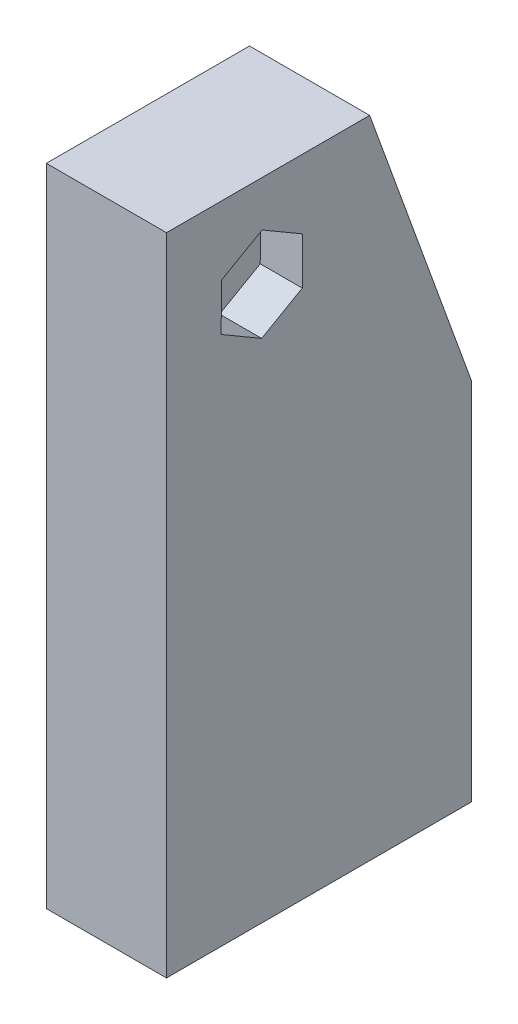
ISO-10303-21;
HEADER;
FILE_DESCRIPTION(('STEP AP214'),'2;1');
FILE_NAME('part.step','',(''),(''),'','','');
FILE_SCHEMA(('AUTOMOTIVE_DESIGN { 1 0 10303 214 1 1 1 1 }'));
ENDSEC;
DATA;
#1=APPLICATION_CONTEXT('core data for automotive mechanical design processes');
#2=APPLICATION_PROTOCOL_DEFINITION('international standard','automotive_design',2000,#1);
#3=PRODUCT_CONTEXT('',#1,'mechanical');
#4=PRODUCT('Part','Part','',(#3));
#5=PRODUCT_RELATED_PRODUCT_CATEGORY('part','',(#4));
#6=PRODUCT_DEFINITION_FORMATION('','',#4);
#7=PRODUCT_DEFINITION_CONTEXT('part definition',#1,'design');
#8=PRODUCT_DEFINITION('design','',#6,#7);
#9=PRODUCT_DEFINITION_SHAPE('','',#8);
#10=(LENGTH_UNIT() NAMED_UNIT(*) SI_UNIT(.MILLI.,.METRE.));
#11=(NAMED_UNIT(*) PLANE_ANGLE_UNIT() SI_UNIT($,.RADIAN.));
#12=(NAMED_UNIT(*) SI_UNIT($,.STERADIAN.) SOLID_ANGLE_UNIT());
#13=UNCERTAINTY_MEASURE_WITH_UNIT(LENGTH_MEASURE(1.E-05),#10,'distance_accuracy_value','');
#14=(GEOMETRIC_REPRESENTATION_CONTEXT(3) GLOBAL_UNCERTAINTY_ASSIGNED_CONTEXT((#13)) GLOBAL_UNIT_ASSIGNED_CONTEXT((#10,
#11,#12)) REPRESENTATION_CONTEXT('',''));
#15=CARTESIAN_POINT('',(0.,0.,0.));
#16=DIRECTION('',(0.,0.,1.));
#17=DIRECTION('',(1.,0.,0.));
#18=AXIS2_PLACEMENT_3D('',#15,#16,#17);
#19=CARTESIAN_POINT('',(84.7484293410802,-27.1169724546259,-50.8));
#20=DIRECTION('',(0.,1.,0.));
#21=DIRECTION('',(0.,0.,1.));
#22=AXIS2_PLACEMENT_3D('',#19,#20,#21);
#23=PLANE('',#22);
#24=DIRECTION('',(-1.,0.,0.));
#25=VECTOR('',#24,1.);
#26=CARTESIAN_POINT('',(104.74942934108,-27.1169724546259,-33.8187440117902));
#27=LINE('',#26,#25);
#28=CARTESIAN_POINT('',(104.74842934108,-27.1169724546259,-33.8187440117902));
#29=VERTEX_POINT('',#28);
#30=CARTESIAN_POINT('',(84.7484293410802,-27.1169724546259,-33.8187440117902));
#31=VERTEX_POINT('',#30);
#32=EDGE_CURVE('E160',#29,#31,#27,.T.);
#33=ORIENTED_EDGE('',*,*,#32,.T.);
#34=DIRECTION('',(0.,0.,1.));
#35=VECTOR('',#34,1.);
#36=CARTESIAN_POINT('',(84.7484293410802,-27.1169724546259,-50.8));
#37=LINE('',#36,#35);
#38=CARTESIAN_POINT('',(84.7484293410802,-27.1169724546259,0.));
#39=VERTEX_POINT('',#38);
#40=EDGE_CURVE('E45',#31,#39,#37,.T.);
#41=ORIENTED_EDGE('',*,*,#40,.T.);
#42=DIRECTION('',(-1.,0.,0.));
#43=VECTOR('',#42,1.);
#44=CARTESIAN_POINT('',(84.7484293410802,-27.1169724546259,0.));
#45=LINE('',#44,#43);
#46=CARTESIAN_POINT('',(104.74842934108,-27.1169724546259,0.));
#47=VERTEX_POINT('',#46);
#48=EDGE_CURVE('E181',#47,#39,#45,.T.);
#49=ORIENTED_EDGE('',*,*,#48,.F.);
#50=DIRECTION('',(0.,0.,1.));
#51=VECTOR('',#50,1.);
#52=CARTESIAN_POINT('',(104.74842934108,-27.1169724546259,-50.8));
#53=LINE('',#52,#51);
#54=EDGE_CURVE('E11',#29,#47,#53,.T.);
#55=ORIENTED_EDGE('',*,*,#54,.F.);
#56=EDGE_LOOP('',(#33,#41,#49,#55));
#57=FACE_BOUND('',#56,.T.);
#58=ADVANCED_FACE('F42',(#57),#23,.T.);
#59=CARTESIAN_POINT('',(104.74842934108,-27.1169724546259,-50.8));
#60=DIRECTION('',(1.,0.,0.));
#61=DIRECTION('',(0.,1.,0.));
#62=AXIS2_PLACEMENT_3D('',#59,#60,#61);
#63=PLANE('',#62);
#64=DIRECTION('',(0.,0.940081369298026,0.340950170990935));
#65=VECTOR('',#64,1.);
#66=CARTESIAN_POINT('',(104.74842934108,-27.1169724546259,-33.8187440117902));
#67=LINE('',#66,#65);
#68=CARTESIAN_POINT('',(104.74842934108,-73.938366722884,-50.8));
#69=VERTEX_POINT('',#68);
#70=EDGE_CURVE('E59',#69,#29,#67,.T.);
#71=ORIENTED_EDGE('',*,*,#70,.T.);
#72=ORIENTED_EDGE('',*,*,#54,.T.);
#73=DIRECTION('',(0.,1.,0.));
#74=VECTOR('',#73,1.);
#75=CARTESIAN_POINT('',(104.74842934108,-27.1169724546259,0.));
#76=LINE('',#75,#74);
#77=CARTESIAN_POINT('',(104.74842934108,-134.553679698753,0.));
#78=VERTEX_POINT('',#77);
#79=EDGE_CURVE('E191',#78,#47,#76,.T.);
#80=ORIENTED_EDGE('',*,*,#79,.F.);
#81=DIRECTION('',(0.,0.,1.));
#82=VECTOR('',#81,1.);
#83=CARTESIAN_POINT('',(104.74842934108,-134.553679698753,-50.8));
#84=LINE('',#83,#82);
#85=CARTESIAN_POINT('',(104.74842934108,-134.553679698753,-50.8));
#86=VERTEX_POINT('',#85);
#87=EDGE_CURVE('E51',#86,#78,#84,.T.);
#88=ORIENTED_EDGE('',*,*,#87,.F.);
#89=DIRECTION('',(0.,1.,0.));
#90=VECTOR('',#89,1.);
#91=CARTESIAN_POINT('',(104.74842934108,-27.1169724546259,-50.8));
#92=LINE('',#91,#90);
#93=EDGE_CURVE('E177',#86,#69,#92,.T.);
#94=ORIENTED_EDGE('',*,*,#93,.T.);
#95=EDGE_LOOP('',(#71,#72,#80,#88,#94));
#96=FACE_BOUND('',#95,.T.);
#97=DIRECTION('',(0.,0.495616398342477,-0.868541527904124));
#98=VECTOR('',#97,1.);
#99=CARTESIAN_POINT('',(104.74842934108,-46.4098612503703,-22.6052163121419));
#100=LINE('',#99,#98);
#101=CARTESIAN_POINT('',(104.74842934108,-50.2728087738409,-15.8356050654815));
#102=VERTEX_POINT('',#101);
#103=CARTESIAN_POINT('',(104.74842934108,-46.4098612503703,-22.605216312142));
#104=VERTEX_POINT('',#103);
#105=EDGE_CURVE('E67',#102,#104,#100,.T.);
#106=ORIENTED_EDGE('',*,*,#105,.F.);
#107=DIRECTION('',(0.,-0.504370828235485,-0.863487155448795));
#108=VECTOR('',#107,1.);
#109=CARTESIAN_POINT('',(104.74842934108,-50.2728087738409,-15.8356050654815));
#110=LINE('',#109,#108);
#111=CARTESIAN_POINT('',(104.74842934108,-46.3416272222233,-9.10538875333951));
#112=VERTEX_POINT('',#111);
#113=EDGE_CURVE('E460',#112,#102,#110,.T.);
#114=ORIENTED_EDGE('',*,*,#113,.F.);
#115=DIRECTION('',(0.,-0.999987226577961,0.00505437245533002));
#116=VECTOR('',#115,1.);
#117=CARTESIAN_POINT('',(104.74842934108,-46.3416272222233,-9.10538875333951));
#118=LINE('',#117,#116);
#119=CARTESIAN_POINT('',(104.74842934108,-38.5474981471352,-9.14478368785804));
#120=VERTEX_POINT('',#119);
#121=EDGE_CURVE('E466',#120,#112,#118,.T.);
#122=ORIENTED_EDGE('',*,*,#121,.F.);
#123=DIRECTION('',(0.,-0.495616398342476,0.868541527904125));
#124=VECTOR('',#123,1.);
#125=CARTESIAN_POINT('',(104.74842934108,-38.5474981471352,-9.14478368785804));
#126=LINE('',#125,#124);
#127=CARTESIAN_POINT('',(104.74842934108,-34.6845506236646,-15.9143949345185));
#128=VERTEX_POINT('',#127);
#129=EDGE_CURVE('E490',#128,#120,#126,.T.);
#130=ORIENTED_EDGE('',*,*,#129,.F.);
#131=DIRECTION('',(0.,0.504370828235485,0.863487155448795));
#132=VECTOR('',#131,1.);
#133=CARTESIAN_POINT('',(104.74842934108,-34.6845506236646,-15.9143949345185));
#134=LINE('',#133,#132);
#135=CARTESIAN_POINT('',(104.74842934108,-38.6157321752822,-22.6446112466605));
#136=VERTEX_POINT('',#135);
#137=EDGE_CURVE('E486',#136,#128,#134,.T.);
#138=ORIENTED_EDGE('',*,*,#137,.F.);
#139=DIRECTION('',(0.,0.999987226577961,-0.00505437245533001));
#140=VECTOR('',#139,1.);
#141=CARTESIAN_POINT('',(104.74842934108,-38.6157321752822,-22.6446112466605));
#142=LINE('',#141,#140);
#143=EDGE_CURVE('E482',#104,#136,#142,.T.);
#144=ORIENTED_EDGE('',*,*,#143,.F.);
#145=EDGE_LOOP('',(#106,#114,#122,#130,#138,#144));
#146=FACE_BOUND('',#145,.T.);
#147=ADVANCED_FACE('F172',(#96,#146),#63,.T.);
#148=CARTESIAN_POINT('',(104.74842934108,-134.553679698753,-50.8));
#149=DIRECTION('',(0.,-1.,0.));
#150=DIRECTION('',(0.,0.,-1.));
#151=AXIS2_PLACEMENT_3D('',#148,#149,#150);
#152=PLANE('',#151);
#153=DIRECTION('',(1.,0.,0.));
#154=VECTOR('',#153,1.);
#155=CARTESIAN_POINT('',(104.74842934108,-134.553679698753,0.));
#156=LINE('',#155,#154);
#157=CARTESIAN_POINT('',(84.7484293410802,-134.553679698753,0.));
#158=VERTEX_POINT('',#157);
#159=EDGE_CURVE('E194',#158,#78,#156,.T.);
#160=ORIENTED_EDGE('',*,*,#159,.F.);
#161=DIRECTION('',(0.,0.,1.));
#162=VECTOR('',#161,1.);
#163=CARTESIAN_POINT('',(84.7484293410802,-134.553679698753,-50.8));
#164=LINE('',#163,#162);
#165=CARTESIAN_POINT('',(84.7484293410802,-134.553679698753,-50.8));
#166=VERTEX_POINT('',#165);
#167=EDGE_CURVE('E208',#166,#158,#164,.T.);
#168=ORIENTED_EDGE('',*,*,#167,.F.);
#169=DIRECTION('',(1.,0.,0.));
#170=VECTOR('',#169,1.);
#171=CARTESIAN_POINT('',(104.74842934108,-134.553679698753,-50.8));
#172=LINE('',#171,#170);
#173=EDGE_CURVE('E201',#166,#86,#172,.T.);
#174=ORIENTED_EDGE('',*,*,#173,.T.);
#175=ORIENTED_EDGE('',*,*,#87,.T.);
#176=EDGE_LOOP('',(#160,#168,#174,#175));
#177=FACE_BOUND('',#176,.T.);
#178=ADVANCED_FACE('F234',(#177),#152,.T.);
#179=CARTESIAN_POINT('',(84.7484293410802,-134.553679698753,-50.8));
#180=DIRECTION('',(-1.,0.,0.));
#181=DIRECTION('',(0.,0.,1.));
#182=AXIS2_PLACEMENT_3D('',#179,#180,#181);
#183=PLANE('',#182);
#184=DIRECTION('',(0.,0.940081369298026,0.340950170990935));
#185=VECTOR('',#184,1.);
#186=CARTESIAN_POINT('',(84.7484293410802,-27.1169724546259,-33.8187440117902));
#187=LINE('',#186,#185);
#188=CARTESIAN_POINT('',(84.7484293410802,-73.938366722884,-50.8));
#189=VERTEX_POINT('',#188);
#190=EDGE_CURVE('E163',#189,#31,#187,.T.);
#191=ORIENTED_EDGE('',*,*,#190,.F.);
#192=DIRECTION('',(0.,-1.,0.));
#193=VECTOR('',#192,1.);
#194=CARTESIAN_POINT('',(84.7484293410802,-134.553679698753,-50.8));
#195=LINE('',#194,#193);
#196=EDGE_CURVE('E196',#189,#166,#195,.T.);
#197=ORIENTED_EDGE('',*,*,#196,.T.);
#198=ORIENTED_EDGE('',*,*,#167,.T.);
#199=DIRECTION('',(0.,-1.,0.));
#200=VECTOR('',#199,1.);
#201=CARTESIAN_POINT('',(84.7484293410802,-134.553679698753,0.));
#202=LINE('',#201,#200);
#203=EDGE_CURVE('E187',#39,#158,#202,.T.);
#204=ORIENTED_EDGE('',*,*,#203,.F.);
#205=ORIENTED_EDGE('',*,*,#40,.F.);
#206=EDGE_LOOP('',(#191,#197,#198,#204,#205));
#207=FACE_BOUND('',#206,.T.);
#208=DIRECTION('',(0.,0.999987226577961,-0.00505437245533002));
#209=VECTOR('',#208,1.);
#210=CARTESIAN_POINT('',(84.7484293410802,-46.3416272222233,-9.10538875333951));
#211=LINE('',#210,#209);
#212=CARTESIAN_POINT('',(84.7484293410802,-46.3416272222233,-9.10538875333951));
#213=VERTEX_POINT('',#212);
#214=CARTESIAN_POINT('',(84.7484293410802,-38.5474981471352,-9.14478368785804));
#215=VERTEX_POINT('',#214);
#216=EDGE_CURVE('E500',#213,#215,#211,.T.);
#217=ORIENTED_EDGE('',*,*,#216,.F.);
#218=DIRECTION('',(0.,0.504370828235485,0.863487155448795));
#219=VECTOR('',#218,1.);
#220=CARTESIAN_POINT('',(84.7484293410802,-50.2728087738409,-15.8356050654815));
#221=LINE('',#220,#219);
#222=CARTESIAN_POINT('',(84.7484293410802,-50.2728087738409,-15.8356050654815));
#223=VERTEX_POINT('',#222);
#224=EDGE_CURVE('E520',#223,#213,#221,.T.);
#225=ORIENTED_EDGE('',*,*,#224,.F.);
#226=DIRECTION('',(0.,-0.495616398342477,0.868541527904124));
#227=VECTOR('',#226,1.);
#228=CARTESIAN_POINT('',(84.7484293410802,-46.4098612503703,-22.6052163121419));
#229=LINE('',#228,#227);
#230=CARTESIAN_POINT('',(84.7484293410802,-46.4098612503703,-22.6052163121419));
#231=VERTEX_POINT('',#230);
#232=EDGE_CURVE('E552',#231,#223,#229,.T.);
#233=ORIENTED_EDGE('',*,*,#232,.F.);
#234=DIRECTION('',(0.,-0.999987226577961,0.00505437245533001));
#235=VECTOR('',#234,1.);
#236=CARTESIAN_POINT('',(84.7484293410802,-38.6157321752822,-22.6446112466605));
#237=LINE('',#236,#235);
#238=CARTESIAN_POINT('',(84.7484293410802,-38.6157321752822,-22.6446112466605));
#239=VERTEX_POINT('',#238);
#240=EDGE_CURVE('E549',#239,#231,#237,.T.);
#241=ORIENTED_EDGE('',*,*,#240,.F.);
#242=DIRECTION('',(0.,-0.504370828235485,-0.863487155448795));
#243=VECTOR('',#242,1.);
#244=CARTESIAN_POINT('',(84.7484293410802,-34.6845506236646,-15.9143949345185));
#245=LINE('',#244,#243);
#246=CARTESIAN_POINT('',(84.7484293410802,-34.6845506236646,-15.9143949345185));
#247=VERTEX_POINT('',#246);
#248=EDGE_CURVE('E546',#247,#239,#245,.T.);
#249=ORIENTED_EDGE('',*,*,#248,.F.);
#250=DIRECTION('',(0.,0.495616398342476,-0.868541527904125));
#251=VECTOR('',#250,1.);
#252=CARTESIAN_POINT('',(84.7484293410802,-38.5474981471352,-9.14478368785804));
#253=LINE('',#252,#251);
#254=EDGE_CURVE('E542',#215,#247,#253,.T.);
#255=ORIENTED_EDGE('',*,*,#254,.F.);
#256=EDGE_LOOP('',(#217,#225,#233,#241,#249,#255));
#257=FACE_BOUND('',#256,.T.);
#258=ADVANCED_FACE('F225',(#207,#257),#183,.T.);
#259=CARTESIAN_POINT('',(0.,0.,-50.8));
#260=DIRECTION('',(0.,0.,-1.));
#261=DIRECTION('',(-1.,0.,0.));
#262=AXIS2_PLACEMENT_3D('',#259,#260,#261);
#263=PLANE('',#262);
#264=DIRECTION('',(1.,0.,0.));
#265=VECTOR('',#264,1.);
#266=CARTESIAN_POINT('',(104.74942934108,-73.938366722884,-50.8));
#267=LINE('',#266,#265);
#268=EDGE_CURVE('E168',#189,#69,#267,.T.);
#269=ORIENTED_EDGE('',*,*,#268,.T.);
#270=ORIENTED_EDGE('',*,*,#93,.F.);
#271=ORIENTED_EDGE('',*,*,#173,.F.);
#272=ORIENTED_EDGE('',*,*,#196,.F.);
#273=EDGE_LOOP('',(#269,#270,#271,#272));
#274=FACE_BOUND('',#273,.T.);
#275=ADVANCED_FACE('F232',(#274),#263,.T.);
#276=CARTESIAN_POINT('',(0.,0.,0.));
#277=DIRECTION('',(0.,0.,-1.));
#278=DIRECTION('',(-1.,0.,0.));
#279=AXIS2_PLACEMENT_3D('',#276,#277,#278);
#280=PLANE('',#279);
#281=ORIENTED_EDGE('',*,*,#48,.T.);
#282=ORIENTED_EDGE('',*,*,#203,.T.);
#283=ORIENTED_EDGE('',*,*,#159,.T.);
#284=ORIENTED_EDGE('',*,*,#79,.T.);
#285=EDGE_LOOP('',(#281,#282,#283,#284));
#286=FACE_BOUND('',#285,.T.);
#287=ADVANCED_FACE('F192',(#286),#280,.F.);
#288=CARTESIAN_POINT('',(91.7484293410802,-46.3416272222233,-9.10538875333951));
#289=DIRECTION('',(0.,0.00505437245533002,0.999987226577961));
#290=DIRECTION('',(0.,-0.999987226577961,0.00505437245533002));
#291=AXIS2_PLACEMENT_3D('',#288,#289,#290);
#292=PLANE('',#291);
#293=ORIENTED_EDGE('',*,*,#216,.T.);
#294=DIRECTION('',(-1.,0.,0.));
#295=VECTOR('',#294,1.);
#296=CARTESIAN_POINT('',(91.7484293410802,-38.5474981471352,-9.14478368785804));
#297=LINE('',#296,#295);
#298=CARTESIAN_POINT('',(91.7484293410802,-38.5474981471352,-9.14478368785804));
#299=VERTEX_POINT('',#298);
#300=EDGE_CURVE('E539',#299,#215,#297,.T.);
#301=ORIENTED_EDGE('',*,*,#300,.F.);
#302=DIRECTION('',(0.,0.999987226577961,-0.00505437245533002));
#303=VECTOR('',#302,1.);
#304=CARTESIAN_POINT('',(91.7484293410802,-46.3416272222233,-9.10538875333951));
#305=LINE('',#304,#303);
#306=CARTESIAN_POINT('',(91.7484293410802,-46.3416272222233,-9.10538875333951));
#307=VERTEX_POINT('',#306);
#308=EDGE_CURVE('E515',#307,#299,#305,.T.);
#309=ORIENTED_EDGE('',*,*,#308,.F.);
#310=DIRECTION('',(-1.,0.,0.));
#311=VECTOR('',#310,1.);
#312=CARTESIAN_POINT('',(91.7484293410802,-46.3416272222233,-9.10538875333951));
#313=LINE('',#312,#311);
#314=EDGE_CURVE('E188',#307,#213,#313,.T.);
#315=ORIENTED_EDGE('',*,*,#314,.T.);
#316=EDGE_LOOP('',(#293,#301,#309,#315));
#317=FACE_BOUND('',#316,.T.);
#318=ADVANCED_FACE('F271',(#317),#292,.F.);
#319=CARTESIAN_POINT('',(91.7484293410802,-50.2728087738409,-15.8356050654815));
#320=DIRECTION('',(0.,-0.863487155448795,0.504370828235485));
#321=DIRECTION('',(0.,-0.504370828235485,-0.863487155448795));
#322=AXIS2_PLACEMENT_3D('',#319,#320,#321);
#323=PLANE('',#322);
#324=ORIENTED_EDGE('',*,*,#224,.T.);
#325=ORIENTED_EDGE('',*,*,#314,.F.);
#326=DIRECTION('',(0.,0.504370828235485,0.863487155448795));
#327=VECTOR('',#326,1.);
#328=CARTESIAN_POINT('',(91.7484293410802,-50.2728087738409,-15.8356050654815));
#329=LINE('',#328,#327);
#330=CARTESIAN_POINT('',(91.7484293410802,-50.2728087738409,-15.8356050654815));
#331=VERTEX_POINT('',#330);
#332=EDGE_CURVE('E535',#331,#307,#329,.T.);
#333=ORIENTED_EDGE('',*,*,#332,.F.);
#334=DIRECTION('',(-1.,0.,0.));
#335=VECTOR('',#334,1.);
#336=CARTESIAN_POINT('',(91.7484293410802,-50.2728087738409,-15.8356050654815));
#337=LINE('',#336,#335);
#338=EDGE_CURVE('E560',#331,#223,#337,.T.);
#339=ORIENTED_EDGE('',*,*,#338,.T.);
#340=EDGE_LOOP('',(#324,#325,#333,#339));
#341=FACE_BOUND('',#340,.T.);
#342=ADVANCED_FACE('F279',(#341),#323,.F.);
#343=CARTESIAN_POINT('',(91.7484293410802,-46.4098612503703,-22.6052163121419));
#344=DIRECTION('',(0.,-0.868541527904124,-0.495616398342477));
#345=DIRECTION('',(0.,0.495616398342477,-0.868541527904125));
#346=AXIS2_PLACEMENT_3D('',#343,#344,#345);
#347=PLANE('',#346);
#348=ORIENTED_EDGE('',*,*,#232,.T.);
#349=ORIENTED_EDGE('',*,*,#338,.F.);
#350=DIRECTION('',(0.,-0.495616398342477,0.868541527904124));
#351=VECTOR('',#350,1.);
#352=CARTESIAN_POINT('',(91.7484293410802,-46.4098612503703,-22.6052163121419));
#353=LINE('',#352,#351);
#354=CARTESIAN_POINT('',(91.7484293410802,-46.4098612503703,-22.6052163121419));
#355=VERTEX_POINT('',#354);
#356=EDGE_CURVE('E531',#355,#331,#353,.T.);
#357=ORIENTED_EDGE('',*,*,#356,.F.);
#358=DIRECTION('',(-1.,0.,0.));
#359=VECTOR('',#358,1.);
#360=CARTESIAN_POINT('',(91.7484293410802,-46.4098612503703,-22.6052163121419));
#361=LINE('',#360,#359);
#362=EDGE_CURVE('E563',#355,#231,#361,.T.);
#363=ORIENTED_EDGE('',*,*,#362,.T.);
#364=EDGE_LOOP('',(#348,#349,#357,#363));
#365=FACE_BOUND('',#364,.T.);
#366=ADVANCED_FACE('F288',(#365),#347,.F.);
#367=CARTESIAN_POINT('',(91.7484293410802,-38.6157321752822,-22.6446112466605));
#368=DIRECTION('',(0.,-0.00505437245533001,-0.999987226577961));
#369=DIRECTION('',(0.,0.999987226577961,-0.00505437245533001));
#370=AXIS2_PLACEMENT_3D('',#367,#368,#369);
#371=PLANE('',#370);
#372=ORIENTED_EDGE('',*,*,#240,.T.);
#373=ORIENTED_EDGE('',*,*,#362,.F.);
#374=DIRECTION('',(0.,-0.999987226577961,0.00505437245533001));
#375=VECTOR('',#374,1.);
#376=CARTESIAN_POINT('',(91.7484293410802,-38.6157321752822,-22.6446112466605));
#377=LINE('',#376,#375);
#378=CARTESIAN_POINT('',(91.7484293410802,-38.6157321752822,-22.6446112466605));
#379=VERTEX_POINT('',#378);
#380=EDGE_CURVE('E527',#379,#355,#377,.T.);
#381=ORIENTED_EDGE('',*,*,#380,.F.);
#382=DIRECTION('',(-1.,0.,0.));
#383=VECTOR('',#382,1.);
#384=CARTESIAN_POINT('',(91.7484293410802,-38.6157321752822,-22.6446112466605));
#385=LINE('',#384,#383);
#386=EDGE_CURVE('E565',#379,#239,#385,.T.);
#387=ORIENTED_EDGE('',*,*,#386,.T.);
#388=EDGE_LOOP('',(#372,#373,#381,#387));
#389=FACE_BOUND('',#388,.T.);
#390=ADVANCED_FACE('F297',(#389),#371,.F.);
#391=CARTESIAN_POINT('',(91.7484293410802,-34.6845506236646,-15.9143949345185));
#392=DIRECTION('',(0.,0.863487155448795,-0.504370828235485));
#393=DIRECTION('',(0.,0.504370828235485,0.863487155448795));
#394=AXIS2_PLACEMENT_3D('',#391,#392,#393);
#395=PLANE('',#394);
#396=ORIENTED_EDGE('',*,*,#248,.T.);
#397=ORIENTED_EDGE('',*,*,#386,.F.);
#398=DIRECTION('',(0.,-0.504370828235485,-0.863487155448795));
#399=VECTOR('',#398,1.);
#400=CARTESIAN_POINT('',(91.7484293410802,-34.6845506236646,-15.9143949345185));
#401=LINE('',#400,#399);
#402=CARTESIAN_POINT('',(91.7484293410802,-34.6845506236646,-15.9143949345185));
#403=VERTEX_POINT('',#402);
#404=EDGE_CURVE('E523',#403,#379,#401,.T.);
#405=ORIENTED_EDGE('',*,*,#404,.F.);
#406=DIRECTION('',(-1.,0.,0.));
#407=VECTOR('',#406,1.);
#408=CARTESIAN_POINT('',(91.7484293410802,-34.6845506236646,-15.9143949345185));
#409=LINE('',#408,#407);
#410=EDGE_CURVE('E568',#403,#247,#409,.T.);
#411=ORIENTED_EDGE('',*,*,#410,.T.);
#412=EDGE_LOOP('',(#396,#397,#405,#411));
#413=FACE_BOUND('',#412,.T.);
#414=ADVANCED_FACE('F306',(#413),#395,.F.);
#415=CARTESIAN_POINT('',(91.7484293410802,-38.5474981471352,-9.14478368785804));
#416=DIRECTION('',(0.,0.868541527904125,0.495616398342476));
#417=DIRECTION('',(0.,-0.495616398342476,0.868541527904125));
#418=AXIS2_PLACEMENT_3D('',#415,#416,#417);
#419=PLANE('',#418);
#420=ORIENTED_EDGE('',*,*,#254,.T.);
#421=ORIENTED_EDGE('',*,*,#410,.F.);
#422=DIRECTION('',(0.,0.495616398342476,-0.868541527904125));
#423=VECTOR('',#422,1.);
#424=CARTESIAN_POINT('',(91.7484293410802,-38.5474981471352,-9.14478368785804));
#425=LINE('',#424,#423);
#426=EDGE_CURVE('E519',#299,#403,#425,.T.);
#427=ORIENTED_EDGE('',*,*,#426,.F.);
#428=ORIENTED_EDGE('',*,*,#300,.T.);
#429=EDGE_LOOP('',(#420,#421,#427,#428));
#430=FACE_BOUND('',#429,.T.);
#431=ADVANCED_FACE('F315',(#430),#419,.F.);
#432=CARTESIAN_POINT('',(91.7484293410802,0.,0.));
#433=DIRECTION('',(-1.,0.,0.));
#434=DIRECTION('',(0.,0.,1.));
#435=AXIS2_PLACEMENT_3D('',#432,#433,#434);
#436=PLANE('',#435);
#437=ORIENTED_EDGE('',*,*,#308,.T.);
#438=ORIENTED_EDGE('',*,*,#426,.T.);
#439=ORIENTED_EDGE('',*,*,#404,.T.);
#440=ORIENTED_EDGE('',*,*,#380,.T.);
#441=ORIENTED_EDGE('',*,*,#356,.T.);
#442=ORIENTED_EDGE('',*,*,#332,.T.);
#443=EDGE_LOOP('',(#437,#438,#439,#440,#441,#442));
#444=FACE_BOUND('',#443,.T.);
#445=ADVANCED_FACE('F324',(#444),#436,.T.);
#446=CARTESIAN_POINT('',(97.7484293410802,-46.4098612503703,-22.6052163121419));
#447=DIRECTION('',(0.,-0.868541527904124,-0.495616398342477));
#448=DIRECTION('',(0.,0.495616398342477,-0.868541527904125));
#449=AXIS2_PLACEMENT_3D('',#446,#447,#448);
#450=PLANE('',#449);
#451=ORIENTED_EDGE('',*,*,#105,.T.);
#452=DIRECTION('',(1.,0.,0.));
#453=VECTOR('',#452,1.);
#454=CARTESIAN_POINT('',(97.7484293410802,-46.4098612503703,-22.6052163121419));
#455=LINE('',#454,#453);
#456=CARTESIAN_POINT('',(97.7484293410802,-46.4098612503703,-22.6052163121419));
#457=VERTEX_POINT('',#456);
#458=EDGE_CURVE('E479',#457,#104,#455,.T.);
#459=ORIENTED_EDGE('',*,*,#458,.F.);
#460=DIRECTION('',(0.,0.495616398342477,-0.868541527904124));
#461=VECTOR('',#460,1.);
#462=CARTESIAN_POINT('',(97.7484293410802,-46.4098612503703,-22.6052163121419));
#463=LINE('',#462,#461);
#464=CARTESIAN_POINT('',(97.7484293410802,-50.2728087738409,-15.8356050654815));
#465=VERTEX_POINT('',#464);
#466=EDGE_CURVE('E453',#465,#457,#463,.T.);
#467=ORIENTED_EDGE('',*,*,#466,.F.);
#468=DIRECTION('',(1.,0.,0.));
#469=VECTOR('',#468,1.);
#470=CARTESIAN_POINT('',(97.7484293410802,-50.2728087738409,-15.8356050654815));
#471=LINE('',#470,#469);
#472=EDGE_CURVE('E497',#465,#102,#471,.T.);
#473=ORIENTED_EDGE('',*,*,#472,.T.);
#474=EDGE_LOOP('',(#451,#459,#467,#473));
#475=FACE_BOUND('',#474,.T.);
#476=ADVANCED_FACE('F333',(#475),#450,.F.);
#477=CARTESIAN_POINT('',(97.7484293410802,-50.2728087738409,-15.8356050654815));
#478=DIRECTION('',(0.,-0.863487155448795,0.504370828235485));
#479=DIRECTION('',(0.,-0.504370828235485,-0.863487155448795));
#480=AXIS2_PLACEMENT_3D('',#477,#478,#479);
#481=PLANE('',#480);
#482=ORIENTED_EDGE('',*,*,#113,.T.);
#483=ORIENTED_EDGE('',*,*,#472,.F.);
#484=DIRECTION('',(0.,-0.504370828235485,-0.863487155448795));
#485=VECTOR('',#484,1.);
#486=CARTESIAN_POINT('',(97.7484293410802,-50.2728087738409,-15.8356050654815));
#487=LINE('',#486,#485);
#488=CARTESIAN_POINT('',(97.7484293410802,-46.3416272222233,-9.10538875333951));
#489=VERTEX_POINT('',#488);
#490=EDGE_CURVE('E459',#489,#465,#487,.T.);
#491=ORIENTED_EDGE('',*,*,#490,.F.);
#492=DIRECTION('',(1.,0.,0.));
#493=VECTOR('',#492,1.);
#494=CARTESIAN_POINT('',(97.7484293410802,-46.3416272222233,-9.10538875333951));
#495=LINE('',#494,#493);
#496=EDGE_CURVE('E501',#489,#112,#495,.T.);
#497=ORIENTED_EDGE('',*,*,#496,.T.);
#498=EDGE_LOOP('',(#482,#483,#491,#497));
#499=FACE_BOUND('',#498,.T.);
#500=ADVANCED_FACE('F342',(#499),#481,.F.);
#501=CARTESIAN_POINT('',(97.7484293410802,-46.3416272222233,-9.10538875333951));
#502=DIRECTION('',(0.,0.00505437245533002,0.999987226577961));
#503=DIRECTION('',(0.,-0.999987226577961,0.00505437245533002));
#504=AXIS2_PLACEMENT_3D('',#501,#502,#503);
#505=PLANE('',#504);
#506=ORIENTED_EDGE('',*,*,#121,.T.);
#507=ORIENTED_EDGE('',*,*,#496,.F.);
#508=DIRECTION('',(0.,-0.999987226577961,0.00505437245533002));
#509=VECTOR('',#508,1.);
#510=CARTESIAN_POINT('',(97.7484293410802,-46.3416272222233,-9.10538875333951));
#511=LINE('',#510,#509);
#512=CARTESIAN_POINT('',(97.7484293410802,-38.5474981471352,-9.14478368785804));
#513=VERTEX_POINT('',#512);
#514=EDGE_CURVE('E475',#513,#489,#511,.T.);
#515=ORIENTED_EDGE('',*,*,#514,.F.);
#516=DIRECTION('',(1.,0.,0.));
#517=VECTOR('',#516,1.);
#518=CARTESIAN_POINT('',(97.7484293410802,-38.5474981471352,-9.14478368785804));
#519=LINE('',#518,#517);
#520=EDGE_CURVE('E504',#513,#120,#519,.T.);
#521=ORIENTED_EDGE('',*,*,#520,.T.);
#522=EDGE_LOOP('',(#506,#507,#515,#521));
#523=FACE_BOUND('',#522,.T.);
#524=ADVANCED_FACE('F350',(#523),#505,.F.);
#525=CARTESIAN_POINT('',(97.7484293410802,-38.5474981471352,-9.14478368785804));
#526=DIRECTION('',(0.,0.868541527904125,0.495616398342476));
#527=DIRECTION('',(0.,-0.495616398342476,0.868541527904125));
#528=AXIS2_PLACEMENT_3D('',#525,#526,#527);
#529=PLANE('',#528);
#530=ORIENTED_EDGE('',*,*,#129,.T.);
#531=ORIENTED_EDGE('',*,*,#520,.F.);
#532=DIRECTION('',(0.,-0.495616398342476,0.868541527904125));
#533=VECTOR('',#532,1.);
#534=CARTESIAN_POINT('',(97.7484293410802,-38.5474981471352,-9.14478368785804));
#535=LINE('',#534,#533);
#536=CARTESIAN_POINT('',(97.7484293410802,-34.6845506236646,-15.9143949345185));
#537=VERTEX_POINT('',#536);
#538=EDGE_CURVE('E471',#537,#513,#535,.T.);
#539=ORIENTED_EDGE('',*,*,#538,.F.);
#540=DIRECTION('',(1.,0.,0.));
#541=VECTOR('',#540,1.);
#542=CARTESIAN_POINT('',(97.7484293410802,-34.6845506236646,-15.9143949345185));
#543=LINE('',#542,#541);
#544=EDGE_CURVE('E507',#537,#128,#543,.T.);
#545=ORIENTED_EDGE('',*,*,#544,.T.);
#546=EDGE_LOOP('',(#530,#531,#539,#545));
#547=FACE_BOUND('',#546,.T.);
#548=ADVANCED_FACE('F359',(#547),#529,.F.);
#549=CARTESIAN_POINT('',(97.7484293410802,-34.6845506236646,-15.9143949345185));
#550=DIRECTION('',(0.,0.863487155448795,-0.504370828235485));
#551=DIRECTION('',(0.,0.504370828235485,0.863487155448795));
#552=AXIS2_PLACEMENT_3D('',#549,#550,#551);
#553=PLANE('',#552);
#554=ORIENTED_EDGE('',*,*,#137,.T.);
#555=ORIENTED_EDGE('',*,*,#544,.F.);
#556=DIRECTION('',(0.,0.504370828235485,0.863487155448795));
#557=VECTOR('',#556,1.);
#558=CARTESIAN_POINT('',(97.7484293410802,-34.6845506236646,-15.9143949345185));
#559=LINE('',#558,#557);
#560=CARTESIAN_POINT('',(97.7484293410802,-38.6157321752822,-22.6446112466605));
#561=VERTEX_POINT('',#560);
#562=EDGE_CURVE('E463',#561,#537,#559,.T.);
#563=ORIENTED_EDGE('',*,*,#562,.F.);
#564=DIRECTION('',(1.,0.,0.));
#565=VECTOR('',#564,1.);
#566=CARTESIAN_POINT('',(97.7484293410802,-38.6157321752822,-22.6446112466605));
#567=LINE('',#566,#565);
#568=EDGE_CURVE('E510',#561,#136,#567,.T.);
#569=ORIENTED_EDGE('',*,*,#568,.T.);
#570=EDGE_LOOP('',(#554,#555,#563,#569));
#571=FACE_BOUND('',#570,.T.);
#572=ADVANCED_FACE('F368',(#571),#553,.F.);
#573=CARTESIAN_POINT('',(97.7484293410802,-38.6157321752822,-22.6446112466605));
#574=DIRECTION('',(0.,-0.00505437245533001,-0.999987226577961));
#575=DIRECTION('',(0.,0.999987226577961,-0.00505437245533001));
#576=AXIS2_PLACEMENT_3D('',#573,#574,#575);
#577=PLANE('',#576);
#578=ORIENTED_EDGE('',*,*,#143,.T.);
#579=ORIENTED_EDGE('',*,*,#568,.F.);
#580=DIRECTION('',(0.,0.999987226577961,-0.00505437245533001));
#581=VECTOR('',#580,1.);
#582=CARTESIAN_POINT('',(97.7484293410802,-38.6157321752822,-22.6446112466605));
#583=LINE('',#582,#581);
#584=EDGE_CURVE('E456',#457,#561,#583,.T.);
#585=ORIENTED_EDGE('',*,*,#584,.F.);
#586=ORIENTED_EDGE('',*,*,#458,.T.);
#587=EDGE_LOOP('',(#578,#579,#585,#586));
#588=FACE_BOUND('',#587,.T.);
#589=ADVANCED_FACE('F377',(#588),#577,.F.);
#590=CARTESIAN_POINT('',(97.7484293410802,0.,0.));
#591=DIRECTION('',(-1.,0.,0.));
#592=DIRECTION('',(0.,0.,1.));
#593=AXIS2_PLACEMENT_3D('',#590,#591,#592);
#594=PLANE('',#593);
#595=ORIENTED_EDGE('',*,*,#466,.T.);
#596=ORIENTED_EDGE('',*,*,#584,.T.);
#597=ORIENTED_EDGE('',*,*,#562,.T.);
#598=ORIENTED_EDGE('',*,*,#538,.T.);
#599=ORIENTED_EDGE('',*,*,#514,.T.);
#600=ORIENTED_EDGE('',*,*,#490,.T.);
#601=EDGE_LOOP('',(#595,#596,#597,#598,#599,#600));
#602=FACE_BOUND('',#601,.T.);
#603=ADVANCED_FACE('F386',(#602),#594,.F.);
#604=CARTESIAN_POINT('',(104.74942934108,-27.1169724546259,-33.8187440117902));
#605=DIRECTION('',(0.,-0.340950170990935,0.940081369298026));
#606=DIRECTION('',(0.,-0.940081369298026,-0.340950170990935));
#607=AXIS2_PLACEMENT_3D('',#604,#605,#606);
#608=PLANE('',#607);
#609=ORIENTED_EDGE('',*,*,#268,.F.);
#610=ORIENTED_EDGE('',*,*,#190,.T.);
#611=ORIENTED_EDGE('',*,*,#32,.F.);
#612=ORIENTED_EDGE('',*,*,#70,.F.);
#613=EDGE_LOOP('',(#609,#610,#611,#612));
#614=FACE_BOUND('',#613,.T.);
#615=ADVANCED_FACE('F161',(#614),#608,.F.);
#616=CLOSED_SHELL('',(#58,#147,#178,#258,#275,#287,#318,#342,#366,#390,#414,#431,#445,#476,#500,
#524,#548,#572,#589,#603,#615));
#617=MANIFOLD_SOLID_BREP('B2',#616);
#618=ADVANCED_BREP_SHAPE_REPRESENTATION('',(#18,#617),#14);
#619=SHAPE_DEFINITION_REPRESENTATION(#9,#618);
ENDSEC;
END-ISO-10303-21;
